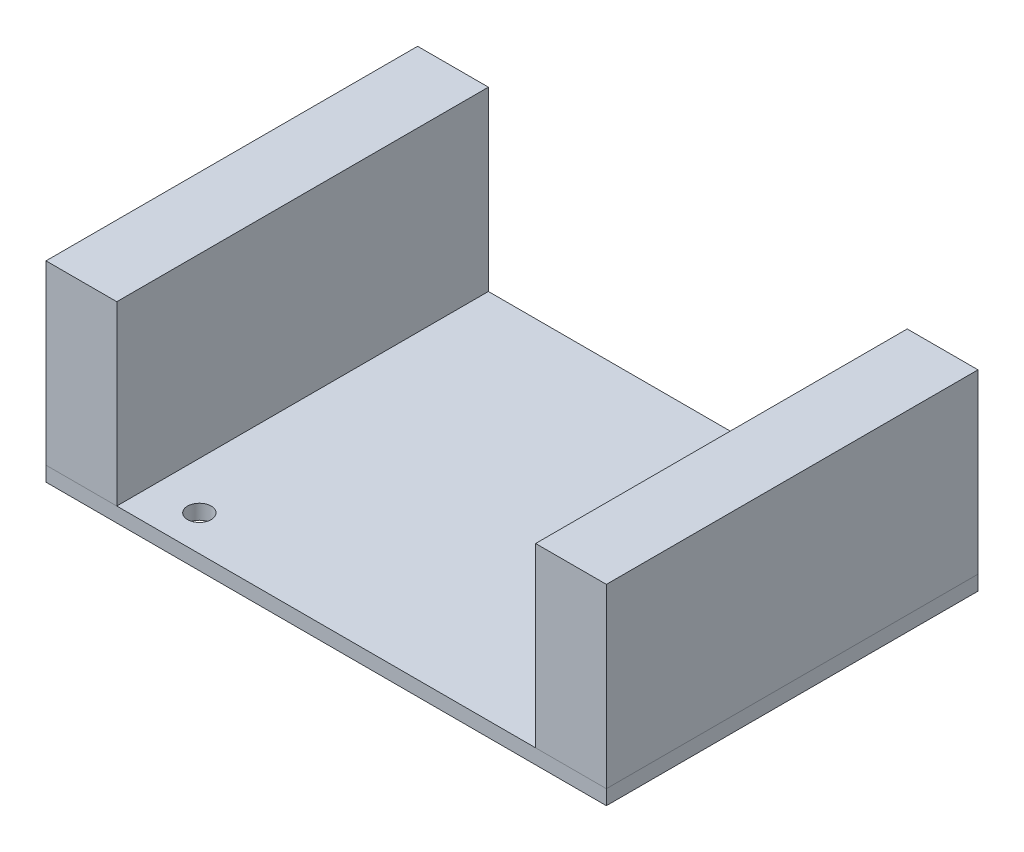
ISO-10303-21;
HEADER;
FILE_DESCRIPTION(('STEP AP214'),'2;1');
FILE_NAME('part.step','',(''),(''),'','','');
FILE_SCHEMA(('AUTOMOTIVE_DESIGN { 1 0 10303 214 1 1 1 1 }'));
ENDSEC;
DATA;
#1=APPLICATION_CONTEXT('core data for automotive mechanical design processes');
#2=APPLICATION_PROTOCOL_DEFINITION('international standard','automotive_design',2000,#1);
#3=PRODUCT_CONTEXT('',#1,'mechanical');
#4=PRODUCT('Part','Part','',(#3));
#5=PRODUCT_RELATED_PRODUCT_CATEGORY('part','',(#4));
#6=PRODUCT_DEFINITION_FORMATION('','',#4);
#7=PRODUCT_DEFINITION_CONTEXT('part definition',#1,'design');
#8=PRODUCT_DEFINITION('design','',#6,#7);
#9=PRODUCT_DEFINITION_SHAPE('','',#8);
#10=(LENGTH_UNIT() NAMED_UNIT(*) SI_UNIT(.MILLI.,.METRE.));
#11=(NAMED_UNIT(*) PLANE_ANGLE_UNIT() SI_UNIT($,.RADIAN.));
#12=(NAMED_UNIT(*) SI_UNIT($,.STERADIAN.) SOLID_ANGLE_UNIT());
#13=UNCERTAINTY_MEASURE_WITH_UNIT(LENGTH_MEASURE(1.E-05),#10,'distance_accuracy_value','');
#14=(GEOMETRIC_REPRESENTATION_CONTEXT(3) GLOBAL_UNCERTAINTY_ASSIGNED_CONTEXT((#13)) GLOBAL_UNIT_ASSIGNED_CONTEXT((#10,
#11,#12)) REPRESENTATION_CONTEXT('',''));
#15=CARTESIAN_POINT('',(0.,0.,0.));
#16=DIRECTION('',(0.,0.,1.));
#17=DIRECTION('',(1.,0.,0.));
#18=AXIS2_PLACEMENT_3D('',#15,#16,#17);
#19=CARTESIAN_POINT('',(23.75,16.25,-15.75));
#20=DIRECTION('',(-1.,0.,0.));
#21=DIRECTION('',(0.,0.,1.));
#22=AXIS2_PLACEMENT_3D('',#19,#20,#21);
#23=PLANE('',#22);
#24=DIRECTION('',(0.,0.,-1.));
#25=VECTOR('',#24,1.);
#26=CARTESIAN_POINT('',(23.75,1.25,-15.75));
#27=LINE('',#26,#25);
#28=CARTESIAN_POINT('',(23.75,1.25,15.75));
#29=VERTEX_POINT('',#28);
#30=CARTESIAN_POINT('',(23.75,1.25,-15.75));
#31=VERTEX_POINT('',#30);
#32=EDGE_CURVE('E113',#29,#31,#27,.T.);
#33=ORIENTED_EDGE('',*,*,#32,.T.);
#34=DIRECTION('',(0.,-1.,0.));
#35=VECTOR('',#34,1.);
#36=CARTESIAN_POINT('',(23.75,16.25,-15.75));
#37=LINE('',#36,#35);
#38=CARTESIAN_POINT('',(23.75,16.25,-15.75));
#39=VERTEX_POINT('',#38);
#40=EDGE_CURVE('E12',#39,#31,#37,.T.);
#41=ORIENTED_EDGE('',*,*,#40,.F.);
#42=DIRECTION('',(0.,0.,-1.));
#43=VECTOR('',#42,1.);
#44=CARTESIAN_POINT('',(23.75,16.25,-15.75));
#45=LINE('',#44,#43);
#46=CARTESIAN_POINT('',(23.75,16.25,15.75));
#47=VERTEX_POINT('',#46);
#48=EDGE_CURVE('E101',#47,#39,#45,.T.);
#49=ORIENTED_EDGE('',*,*,#48,.F.);
#50=DIRECTION('',(0.,-1.,0.));
#51=VECTOR('',#50,1.);
#52=CARTESIAN_POINT('',(23.75,16.25,15.75));
#53=LINE('',#52,#51);
#54=EDGE_CURVE('E109',#47,#29,#53,.T.);
#55=ORIENTED_EDGE('',*,*,#54,.T.);
#56=EDGE_LOOP('',(#33,#41,#49,#55));
#57=FACE_BOUND('',#56,.T.);
#58=ADVANCED_FACE('F50',(#57),#23,.F.);
#59=CARTESIAN_POINT('',(23.75,16.25,-15.75));
#60=DIRECTION('',(0.,0.,1.));
#61=DIRECTION('',(1.,0.,0.));
#62=AXIS2_PLACEMENT_3D('',#59,#60,#61);
#63=PLANE('',#62);
#64=DIRECTION('',(-1.,0.,0.));
#65=VECTOR('',#64,1.);
#66=CARTESIAN_POINT('',(23.75,1.25,-15.75));
#67=LINE('',#66,#65);
#68=CARTESIAN_POINT('',(17.75,1.25,-15.75));
#69=VERTEX_POINT('',#68);
#70=EDGE_CURVE('E105',#31,#69,#67,.T.);
#71=ORIENTED_EDGE('',*,*,#70,.T.);
#72=DIRECTION('',(0.,-1.,0.));
#73=VECTOR('',#72,1.);
#74=CARTESIAN_POINT('',(17.75,16.25,-15.75));
#75=LINE('',#74,#73);
#76=CARTESIAN_POINT('',(17.75,16.25,-15.75));
#77=VERTEX_POINT('',#76);
#78=EDGE_CURVE('E58',#77,#69,#75,.T.);
#79=ORIENTED_EDGE('',*,*,#78,.F.);
#80=DIRECTION('',(-1.,0.,0.));
#81=VECTOR('',#80,1.);
#82=CARTESIAN_POINT('',(23.75,16.25,-15.75));
#83=LINE('',#82,#81);
#84=EDGE_CURVE('E96',#39,#77,#83,.T.);
#85=ORIENTED_EDGE('',*,*,#84,.F.);
#86=ORIENTED_EDGE('',*,*,#40,.T.);
#87=EDGE_LOOP('',(#71,#79,#85,#86));
#88=FACE_BOUND('',#87,.T.);
#89=ADVANCED_FACE('F104',(#88),#63,.F.);
#90=CARTESIAN_POINT('',(17.75,16.25,-15.75));
#91=DIRECTION('',(1.,0.,0.));
#92=DIRECTION('',(0.,0.,-1.));
#93=AXIS2_PLACEMENT_3D('',#90,#91,#92);
#94=PLANE('',#93);
#95=DIRECTION('',(0.,0.,1.));
#96=VECTOR('',#95,1.);
#97=CARTESIAN_POINT('',(17.75,1.25,-15.75));
#98=LINE('',#97,#96);
#99=CARTESIAN_POINT('',(17.75,1.25,15.75));
#100=VERTEX_POINT('',#99);
#101=EDGE_CURVE('E83',#69,#100,#98,.T.);
#102=ORIENTED_EDGE('',*,*,#101,.T.);
#103=DIRECTION('',(0.,-1.,0.));
#104=VECTOR('',#103,1.);
#105=CARTESIAN_POINT('',(17.75,16.25,15.75));
#106=LINE('',#105,#104);
#107=CARTESIAN_POINT('',(17.75,16.25,15.75));
#108=VERTEX_POINT('',#107);
#109=EDGE_CURVE('E106',#108,#100,#106,.T.);
#110=ORIENTED_EDGE('',*,*,#109,.F.);
#111=DIRECTION('',(0.,0.,1.));
#112=VECTOR('',#111,1.);
#113=CARTESIAN_POINT('',(17.75,16.25,-15.75));
#114=LINE('',#113,#112);
#115=EDGE_CURVE('E99',#77,#108,#114,.T.);
#116=ORIENTED_EDGE('',*,*,#115,.F.);
#117=ORIENTED_EDGE('',*,*,#78,.T.);
#118=EDGE_LOOP('',(#102,#110,#116,#117));
#119=FACE_BOUND('',#118,.T.);
#120=ADVANCED_FACE('F107',(#119),#94,.F.);
#121=CARTESIAN_POINT('',(23.75,16.25,15.75));
#122=DIRECTION('',(0.,0.,-1.));
#123=DIRECTION('',(-1.,0.,0.));
#124=AXIS2_PLACEMENT_3D('',#121,#122,#123);
#125=PLANE('',#124);
#126=DIRECTION('',(1.,0.,0.));
#127=VECTOR('',#126,1.);
#128=CARTESIAN_POINT('',(23.75,1.25,15.75));
#129=LINE('',#128,#127);
#130=EDGE_CURVE('E89',#100,#29,#129,.T.);
#131=ORIENTED_EDGE('',*,*,#130,.T.);
#132=ORIENTED_EDGE('',*,*,#54,.F.);
#133=DIRECTION('',(1.,0.,0.));
#134=VECTOR('',#133,1.);
#135=CARTESIAN_POINT('',(23.75,16.25,15.75));
#136=LINE('',#135,#134);
#137=EDGE_CURVE('E66',#108,#47,#136,.T.);
#138=ORIENTED_EDGE('',*,*,#137,.F.);
#139=ORIENTED_EDGE('',*,*,#109,.T.);
#140=EDGE_LOOP('',(#131,#132,#138,#139));
#141=FACE_BOUND('',#140,.T.);
#142=ADVANCED_FACE('F120',(#141),#125,.F.);
#143=CARTESIAN_POINT('',(0.,16.25,0.));
#144=DIRECTION('',(0.,-1.,0.));
#145=DIRECTION('',(0.,0.,-1.));
#146=AXIS2_PLACEMENT_3D('',#143,#144,#145);
#147=PLANE('',#146);
#148=ORIENTED_EDGE('',*,*,#48,.T.);
#149=ORIENTED_EDGE('',*,*,#84,.T.);
#150=ORIENTED_EDGE('',*,*,#115,.T.);
#151=ORIENTED_EDGE('',*,*,#137,.T.);
#152=EDGE_LOOP('',(#148,#149,#150,#151));
#153=FACE_BOUND('',#152,.T.);
#154=ADVANCED_FACE('F97',(#153),#147,.F.);
#155=CARTESIAN_POINT('',(0.,1.25,0.));
#156=DIRECTION('',(0.,-1.,0.));
#157=DIRECTION('',(0.,0.,-1.));
#158=AXIS2_PLACEMENT_3D('',#155,#156,#157);
#159=PLANE('',#158);
#160=ORIENTED_EDGE('',*,*,#32,.F.);
#161=ORIENTED_EDGE('',*,*,#130,.F.);
#162=ORIENTED_EDGE('',*,*,#101,.F.);
#163=ORIENTED_EDGE('',*,*,#70,.F.);
#164=EDGE_LOOP('',(#160,#161,#162,#163));
#165=FACE_BOUND('',#164,.T.);
#166=ADVANCED_FACE('F123',(#165),#159,.T.);
#167=CLOSED_SHELL('',(#58,#89,#120,#142,#154,#166));
#168=MANIFOLD_SOLID_BREP('B2',#167);
#169=CARTESIAN_POINT('',(-23.75,16.25,-15.75));
#170=DIRECTION('',(1.,0.,0.));
#171=DIRECTION('',(0.,0.,-1.));
#172=AXIS2_PLACEMENT_3D('',#169,#170,#171);
#173=PLANE('',#172);
#174=DIRECTION('',(0.,0.,1.));
#175=VECTOR('',#174,1.);
#176=CARTESIAN_POINT('',(-23.75,1.25,-15.75));
#177=LINE('',#176,#175);
#178=CARTESIAN_POINT('',(-23.75,1.25,-15.75));
#179=VERTEX_POINT('',#178);
#180=CARTESIAN_POINT('',(-23.75,1.25,15.75));
#181=VERTEX_POINT('',#180);
#182=EDGE_CURVE('E251',#179,#181,#177,.T.);
#183=ORIENTED_EDGE('',*,*,#182,.T.);
#184=DIRECTION('',(0.,-1.,0.));
#185=VECTOR('',#184,1.);
#186=CARTESIAN_POINT('',(-23.75,16.25,15.75));
#187=LINE('',#186,#185);
#188=CARTESIAN_POINT('',(-23.75,16.25,15.75));
#189=VERTEX_POINT('',#188);
#190=EDGE_CURVE('E48',#189,#181,#187,.T.);
#191=ORIENTED_EDGE('',*,*,#190,.F.);
#192=DIRECTION('',(0.,0.,1.));
#193=VECTOR('',#192,1.);
#194=CARTESIAN_POINT('',(-23.75,16.25,-15.75));
#195=LINE('',#194,#193);
#196=CARTESIAN_POINT('',(-23.75,16.25,-15.75));
#197=VERTEX_POINT('',#196);
#198=EDGE_CURVE('E235',#197,#189,#195,.T.);
#199=ORIENTED_EDGE('',*,*,#198,.F.);
#200=DIRECTION('',(0.,-1.,0.));
#201=VECTOR('',#200,1.);
#202=CARTESIAN_POINT('',(-23.75,16.25,-15.75));
#203=LINE('',#202,#201);
#204=EDGE_CURVE('E247',#197,#179,#203,.T.);
#205=ORIENTED_EDGE('',*,*,#204,.T.);
#206=EDGE_LOOP('',(#183,#191,#199,#205));
#207=FACE_BOUND('',#206,.T.);
#208=ADVANCED_FACE('F183',(#207),#173,.F.);
#209=CARTESIAN_POINT('',(-23.75,16.25,15.75));
#210=DIRECTION('',(0.,0.,-1.));
#211=DIRECTION('',(-1.,0.,0.));
#212=AXIS2_PLACEMENT_3D('',#209,#210,#211);
#213=PLANE('',#212);
#214=DIRECTION('',(1.,0.,0.));
#215=VECTOR('',#214,1.);
#216=CARTESIAN_POINT('',(-23.75,1.25,15.75));
#217=LINE('',#216,#215);
#218=CARTESIAN_POINT('',(-17.75,1.25,15.75));
#219=VERTEX_POINT('',#218);
#220=EDGE_CURVE('E240',#181,#219,#217,.T.);
#221=ORIENTED_EDGE('',*,*,#220,.T.);
#222=DIRECTION('',(0.,-1.,0.));
#223=VECTOR('',#222,1.);
#224=CARTESIAN_POINT('',(-17.75,16.25,15.75));
#225=LINE('',#224,#223);
#226=CARTESIAN_POINT('',(-17.75,16.25,15.75));
#227=VERTEX_POINT('',#226);
#228=EDGE_CURVE('E192',#227,#219,#225,.T.);
#229=ORIENTED_EDGE('',*,*,#228,.F.);
#230=DIRECTION('',(1.,0.,0.));
#231=VECTOR('',#230,1.);
#232=CARTESIAN_POINT('',(-23.75,16.25,15.75));
#233=LINE('',#232,#231);
#234=EDGE_CURVE('E230',#189,#227,#233,.T.);
#235=ORIENTED_EDGE('',*,*,#234,.F.);
#236=ORIENTED_EDGE('',*,*,#190,.T.);
#237=EDGE_LOOP('',(#221,#229,#235,#236));
#238=FACE_BOUND('',#237,.T.);
#239=ADVANCED_FACE('F239',(#238),#213,.F.);
#240=CARTESIAN_POINT('',(-17.75,16.25,-15.75));
#241=DIRECTION('',(-1.,0.,0.));
#242=DIRECTION('',(0.,0.,1.));
#243=AXIS2_PLACEMENT_3D('',#240,#241,#242);
#244=PLANE('',#243);
#245=DIRECTION('',(0.,0.,-1.));
#246=VECTOR('',#245,1.);
#247=CARTESIAN_POINT('',(-17.75,1.25,-15.75));
#248=LINE('',#247,#246);
#249=CARTESIAN_POINT('',(-17.75,1.25,-15.75));
#250=VERTEX_POINT('',#249);
#251=EDGE_CURVE('E217',#219,#250,#248,.T.);
#252=ORIENTED_EDGE('',*,*,#251,.T.);
#253=DIRECTION('',(0.,-1.,0.));
#254=VECTOR('',#253,1.);
#255=CARTESIAN_POINT('',(-17.75,16.25,-15.75));
#256=LINE('',#255,#254);
#257=CARTESIAN_POINT('',(-17.75,16.25,-15.75));
#258=VERTEX_POINT('',#257);
#259=EDGE_CURVE('E242',#258,#250,#256,.T.);
#260=ORIENTED_EDGE('',*,*,#259,.F.);
#261=DIRECTION('',(0.,0.,-1.));
#262=VECTOR('',#261,1.);
#263=CARTESIAN_POINT('',(-17.75,16.25,-15.75));
#264=LINE('',#263,#262);
#265=EDGE_CURVE('E233',#227,#258,#264,.T.);
#266=ORIENTED_EDGE('',*,*,#265,.F.);
#267=ORIENTED_EDGE('',*,*,#228,.T.);
#268=EDGE_LOOP('',(#252,#260,#266,#267));
#269=FACE_BOUND('',#268,.T.);
#270=ADVANCED_FACE('F243',(#269),#244,.F.);
#271=CARTESIAN_POINT('',(-23.75,16.25,-15.75));
#272=DIRECTION('',(0.,0.,1.));
#273=DIRECTION('',(1.,0.,0.));
#274=AXIS2_PLACEMENT_3D('',#271,#272,#273);
#275=PLANE('',#274);
#276=DIRECTION('',(-1.,0.,0.));
#277=VECTOR('',#276,1.);
#278=CARTESIAN_POINT('',(-23.75,1.25,-15.75));
#279=LINE('',#278,#277);
#280=EDGE_CURVE('E223',#250,#179,#279,.T.);
#281=ORIENTED_EDGE('',*,*,#280,.T.);
#282=ORIENTED_EDGE('',*,*,#204,.F.);
#283=DIRECTION('',(-1.,0.,0.));
#284=VECTOR('',#283,1.);
#285=CARTESIAN_POINT('',(-23.75,16.25,-15.75));
#286=LINE('',#285,#284);
#287=EDGE_CURVE('E200',#258,#197,#286,.T.);
#288=ORIENTED_EDGE('',*,*,#287,.F.);
#289=ORIENTED_EDGE('',*,*,#259,.T.);
#290=EDGE_LOOP('',(#281,#282,#288,#289));
#291=FACE_BOUND('',#290,.T.);
#292=ADVANCED_FACE('F264',(#291),#275,.F.);
#293=CARTESIAN_POINT('',(0.,16.25,0.));
#294=DIRECTION('',(0.,1.,0.));
#295=DIRECTION('',(0.,0.,1.));
#296=AXIS2_PLACEMENT_3D('',#293,#294,#295);
#297=PLANE('',#296);
#298=ORIENTED_EDGE('',*,*,#198,.T.);
#299=ORIENTED_EDGE('',*,*,#234,.T.);
#300=ORIENTED_EDGE('',*,*,#265,.T.);
#301=ORIENTED_EDGE('',*,*,#287,.T.);
#302=EDGE_LOOP('',(#298,#299,#300,#301));
#303=FACE_BOUND('',#302,.T.);
#304=ADVANCED_FACE('F231',(#303),#297,.T.);
#305=CARTESIAN_POINT('',(0.,1.25,0.));
#306=DIRECTION('',(0.,1.,0.));
#307=DIRECTION('',(0.,0.,1.));
#308=AXIS2_PLACEMENT_3D('',#305,#306,#307);
#309=PLANE('',#308);
#310=ORIENTED_EDGE('',*,*,#182,.F.);
#311=ORIENTED_EDGE('',*,*,#280,.F.);
#312=ORIENTED_EDGE('',*,*,#251,.F.);
#313=ORIENTED_EDGE('',*,*,#220,.F.);
#314=EDGE_LOOP('',(#310,#311,#312,#313));
#315=FACE_BOUND('',#314,.T.);
#316=ADVANCED_FACE('F267',(#315),#309,.F.);
#317=CLOSED_SHELL('',(#208,#239,#270,#292,#304,#316));
#318=MANIFOLD_SOLID_BREP('B6',#317);
#319=CARTESIAN_POINT('',(0.,1.25,0.));
#320=DIRECTION('',(0.,1.,0.));
#321=DIRECTION('',(0.,0.,1.));
#322=AXIS2_PLACEMENT_3D('',#319,#320,#321);
#323=PLANE('',#322);
#324=CARTESIAN_POINT('',(13.75,1.25,-12.75));
#325=DIRECTION('',(0.,1.,0.));
#326=DIRECTION('',(0.,0.,1.));
#327=AXIS2_PLACEMENT_3D('',#324,#325,#326);
#328=CIRCLE('',#327,1.);
#329=CARTESIAN_POINT('',(13.75,1.25,-11.75));
#330=VERTEX_POINT('',#329);
#331=EDGE_CURVE('E386',#330,#330,#328,.T.);
#332=ORIENTED_EDGE('',*,*,#331,.F.);
#333=EDGE_LOOP('',(#332));
#334=FACE_BOUND('',#333,.T.);
#335=DIRECTION('',(0.,0.,-1.));
#336=VECTOR('',#335,1.);
#337=CARTESIAN_POINT('',(23.75,1.25,-15.75));
#338=LINE('',#337,#336);
#339=CARTESIAN_POINT('',(23.75,1.25,15.75));
#340=VERTEX_POINT('',#339);
#341=CARTESIAN_POINT('',(23.75,1.25,-15.75));
#342=VERTEX_POINT('',#341);
#343=EDGE_CURVE('E371',#340,#342,#338,.T.);
#344=ORIENTED_EDGE('',*,*,#343,.T.);
#345=DIRECTION('',(-1.,0.,0.));
#346=VECTOR('',#345,1.);
#347=CARTESIAN_POINT('',(-23.75,1.25,-15.75));
#348=LINE('',#347,#346);
#349=CARTESIAN_POINT('',(-23.75,1.25,-15.75));
#350=VERTEX_POINT('',#349);
#351=EDGE_CURVE('E366',#342,#350,#348,.T.);
#352=ORIENTED_EDGE('',*,*,#351,.T.);
#353=DIRECTION('',(0.,0.,1.));
#354=VECTOR('',#353,1.);
#355=CARTESIAN_POINT('',(-23.75,1.25,-15.75));
#356=LINE('',#355,#354);
#357=CARTESIAN_POINT('',(-23.75,1.25,15.75));
#358=VERTEX_POINT('',#357);
#359=EDGE_CURVE('E369',#350,#358,#356,.T.);
#360=ORIENTED_EDGE('',*,*,#359,.T.);
#361=DIRECTION('',(1.,0.,0.));
#362=VECTOR('',#361,1.);
#363=CARTESIAN_POINT('',(-23.75,1.25,15.75));
#364=LINE('',#363,#362);
#365=EDGE_CURVE('E336',#358,#340,#364,.T.);
#366=ORIENTED_EDGE('',*,*,#365,.T.);
#367=EDGE_LOOP('',(#344,#352,#360,#366));
#368=FACE_BOUND('',#367,.T.);
#369=CARTESIAN_POINT('',(-13.75,1.25,12.75));
#370=DIRECTION('',(0.,1.,0.));
#371=DIRECTION('',(0.,0.,1.));
#372=AXIS2_PLACEMENT_3D('',#369,#370,#371);
#373=CIRCLE('',#372,0.999999999999999);
#374=CARTESIAN_POINT('',(-13.75,1.25,13.75));
#375=VERTEX_POINT('',#374);
#376=EDGE_CURVE('E401',#375,#375,#373,.T.);
#377=ORIENTED_EDGE('',*,*,#376,.F.);
#378=EDGE_LOOP('',(#377));
#379=FACE_BOUND('',#378,.T.);
#380=ADVANCED_FACE('F319',(#334,#368,#379),#323,.T.);
#381=CARTESIAN_POINT('',(0.,0.,0.));
#382=DIRECTION('',(0.,1.,0.));
#383=DIRECTION('',(0.,0.,1.));
#384=AXIS2_PLACEMENT_3D('',#381,#382,#383);
#385=PLANE('',#384);
#386=DIRECTION('',(0.,0.,-1.));
#387=VECTOR('',#386,1.);
#388=CARTESIAN_POINT('',(23.75,0.,-15.75));
#389=LINE('',#388,#387);
#390=CARTESIAN_POINT('',(23.75,0.,15.75));
#391=VERTEX_POINT('',#390);
#392=CARTESIAN_POINT('',(23.75,0.,-15.75));
#393=VERTEX_POINT('',#392);
#394=EDGE_CURVE('E383',#391,#393,#389,.T.);
#395=ORIENTED_EDGE('',*,*,#394,.F.);
#396=DIRECTION('',(1.,0.,0.));
#397=VECTOR('',#396,1.);
#398=CARTESIAN_POINT('',(-23.75,0.,15.75));
#399=LINE('',#398,#397);
#400=CARTESIAN_POINT('',(-23.75,0.,15.75));
#401=VERTEX_POINT('',#400);
#402=EDGE_CURVE('E359',#401,#391,#399,.T.);
#403=ORIENTED_EDGE('',*,*,#402,.F.);
#404=DIRECTION('',(0.,0.,1.));
#405=VECTOR('',#404,1.);
#406=CARTESIAN_POINT('',(-23.75,0.,-15.75));
#407=LINE('',#406,#405);
#408=CARTESIAN_POINT('',(-23.75,0.,-15.75));
#409=VERTEX_POINT('',#408);
#410=EDGE_CURVE('E353',#409,#401,#407,.T.);
#411=ORIENTED_EDGE('',*,*,#410,.F.);
#412=DIRECTION('',(-1.,0.,0.));
#413=VECTOR('',#412,1.);
#414=CARTESIAN_POINT('',(-23.75,0.,-15.75));
#415=LINE('',#414,#413);
#416=EDGE_CURVE('E375',#393,#409,#415,.T.);
#417=ORIENTED_EDGE('',*,*,#416,.F.);
#418=EDGE_LOOP('',(#395,#403,#411,#417));
#419=FACE_BOUND('',#418,.T.);
#420=CARTESIAN_POINT('',(13.75,0.,-12.75));
#421=DIRECTION('',(0.,1.,0.));
#422=DIRECTION('',(0.,0.,1.));
#423=AXIS2_PLACEMENT_3D('',#420,#421,#422);
#424=CIRCLE('',#423,1.);
#425=CARTESIAN_POINT('',(13.75,0.,-11.75));
#426=VERTEX_POINT('',#425);
#427=EDGE_CURVE('E398',#426,#426,#424,.T.);
#428=ORIENTED_EDGE('',*,*,#427,.T.);
#429=EDGE_LOOP('',(#428));
#430=FACE_BOUND('',#429,.T.);
#431=CARTESIAN_POINT('',(-13.75,0.,12.75));
#432=DIRECTION('',(0.,1.,0.));
#433=DIRECTION('',(0.,0.,1.));
#434=AXIS2_PLACEMENT_3D('',#431,#432,#433);
#435=CIRCLE('',#434,0.999999999999999);
#436=CARTESIAN_POINT('',(-13.75,0.,13.75));
#437=VERTEX_POINT('',#436);
#438=EDGE_CURVE('E404',#437,#437,#435,.T.);
#439=ORIENTED_EDGE('',*,*,#438,.T.);
#440=EDGE_LOOP('',(#439));
#441=FACE_BOUND('',#440,.T.);
#442=ADVANCED_FACE('F394',(#419,#430,#441),#385,.F.);
#443=CARTESIAN_POINT('',(23.75,1.25,-15.75));
#444=DIRECTION('',(-1.,0.,0.));
#445=DIRECTION('',(0.,0.,1.));
#446=AXIS2_PLACEMENT_3D('',#443,#444,#445);
#447=PLANE('',#446);
#448=ORIENTED_EDGE('',*,*,#394,.T.);
#449=DIRECTION('',(0.,-1.,0.));
#450=VECTOR('',#449,1.);
#451=CARTESIAN_POINT('',(23.75,1.25,-15.75));
#452=LINE('',#451,#450);
#453=EDGE_CURVE('E181',#342,#393,#452,.T.);
#454=ORIENTED_EDGE('',*,*,#453,.F.);
#455=ORIENTED_EDGE('',*,*,#343,.F.);
#456=DIRECTION('',(0.,-1.,0.));
#457=VECTOR('',#456,1.);
#458=CARTESIAN_POINT('',(23.75,1.25,15.75));
#459=LINE('',#458,#457);
#460=EDGE_CURVE('E379',#340,#391,#459,.T.);
#461=ORIENTED_EDGE('',*,*,#460,.T.);
#462=EDGE_LOOP('',(#448,#454,#455,#461));
#463=FACE_BOUND('',#462,.T.);
#464=ADVANCED_FACE('F321',(#463),#447,.F.);
#465=CARTESIAN_POINT('',(-23.75,1.25,-15.75));
#466=DIRECTION('',(0.,0.,1.));
#467=DIRECTION('',(1.,0.,0.));
#468=AXIS2_PLACEMENT_3D('',#465,#466,#467);
#469=PLANE('',#468);
#470=ORIENTED_EDGE('',*,*,#416,.T.);
#471=DIRECTION('',(0.,-1.,0.));
#472=VECTOR('',#471,1.);
#473=CARTESIAN_POINT('',(-23.75,1.25,-15.75));
#474=LINE('',#473,#472);
#475=EDGE_CURVE('E328',#350,#409,#474,.T.);
#476=ORIENTED_EDGE('',*,*,#475,.F.);
#477=ORIENTED_EDGE('',*,*,#351,.F.);
#478=ORIENTED_EDGE('',*,*,#453,.T.);
#479=EDGE_LOOP('',(#470,#476,#477,#478));
#480=FACE_BOUND('',#479,.T.);
#481=ADVANCED_FACE('F374',(#480),#469,.F.);
#482=CARTESIAN_POINT('',(-23.75,1.25,-15.75));
#483=DIRECTION('',(1.,0.,0.));
#484=DIRECTION('',(0.,0.,-1.));
#485=AXIS2_PLACEMENT_3D('',#482,#483,#484);
#486=PLANE('',#485);
#487=ORIENTED_EDGE('',*,*,#410,.T.);
#488=DIRECTION('',(0.,-1.,0.));
#489=VECTOR('',#488,1.);
#490=CARTESIAN_POINT('',(-23.75,1.25,15.75));
#491=LINE('',#490,#489);
#492=EDGE_CURVE('E376',#358,#401,#491,.T.);
#493=ORIENTED_EDGE('',*,*,#492,.F.);
#494=ORIENTED_EDGE('',*,*,#359,.F.);
#495=ORIENTED_EDGE('',*,*,#475,.T.);
#496=EDGE_LOOP('',(#487,#493,#494,#495));
#497=FACE_BOUND('',#496,.T.);
#498=ADVANCED_FACE('F377',(#497),#486,.F.);
#499=CARTESIAN_POINT('',(-23.75,1.25,15.75));
#500=DIRECTION('',(0.,0.,-1.));
#501=DIRECTION('',(-1.,0.,0.));
#502=AXIS2_PLACEMENT_3D('',#499,#500,#501);
#503=PLANE('',#502);
#504=ORIENTED_EDGE('',*,*,#402,.T.);
#505=ORIENTED_EDGE('',*,*,#460,.F.);
#506=ORIENTED_EDGE('',*,*,#365,.F.);
#507=ORIENTED_EDGE('',*,*,#492,.T.);
#508=EDGE_LOOP('',(#504,#505,#506,#507));
#509=FACE_BOUND('',#508,.T.);
#510=ADVANCED_FACE('F391',(#509),#503,.F.);
#511=CARTESIAN_POINT('',(13.75,1.25,-12.75));
#512=DIRECTION('',(0.,-1.,0.));
#513=DIRECTION('',(0.,0.,-1.));
#514=AXIS2_PLACEMENT_3D('',#511,#512,#513);
#515=CYLINDRICAL_SURFACE('',#514,1.);
#516=ORIENTED_EDGE('',*,*,#331,.T.);
#517=EDGE_LOOP('',(#516));
#518=FACE_BOUND('',#517,.T.);
#519=ORIENTED_EDGE('',*,*,#427,.F.);
#520=EDGE_LOOP('',(#519));
#521=FACE_BOUND('',#520,.T.);
#522=ADVANCED_FACE('F421',(#518,#521),#515,.F.);
#523=CARTESIAN_POINT('',(-13.75,1.25,12.75));
#524=DIRECTION('',(0.,-1.,0.));
#525=DIRECTION('',(0.,0.,-1.));
#526=AXIS2_PLACEMENT_3D('',#523,#524,#525);
#527=CYLINDRICAL_SURFACE('',#526,0.999999999999999);
#528=ORIENTED_EDGE('',*,*,#376,.T.);
#529=EDGE_LOOP('',(#528));
#530=FACE_BOUND('',#529,.T.);
#531=ORIENTED_EDGE('',*,*,#438,.F.);
#532=EDGE_LOOP('',(#531));
#533=FACE_BOUND('',#532,.T.);
#534=ADVANCED_FACE('F410',(#530,#533),#527,.F.);
#535=CLOSED_SHELL('',(#380,#442,#464,#481,#498,#510,#522,#534));
#536=MANIFOLD_SOLID_BREP('B42',#535);
#537=ADVANCED_BREP_SHAPE_REPRESENTATION('',(#18,#168,#318,#536),#14);
#538=SHAPE_DEFINITION_REPRESENTATION(#9,#537);
ENDSEC;
END-ISO-10303-21;
